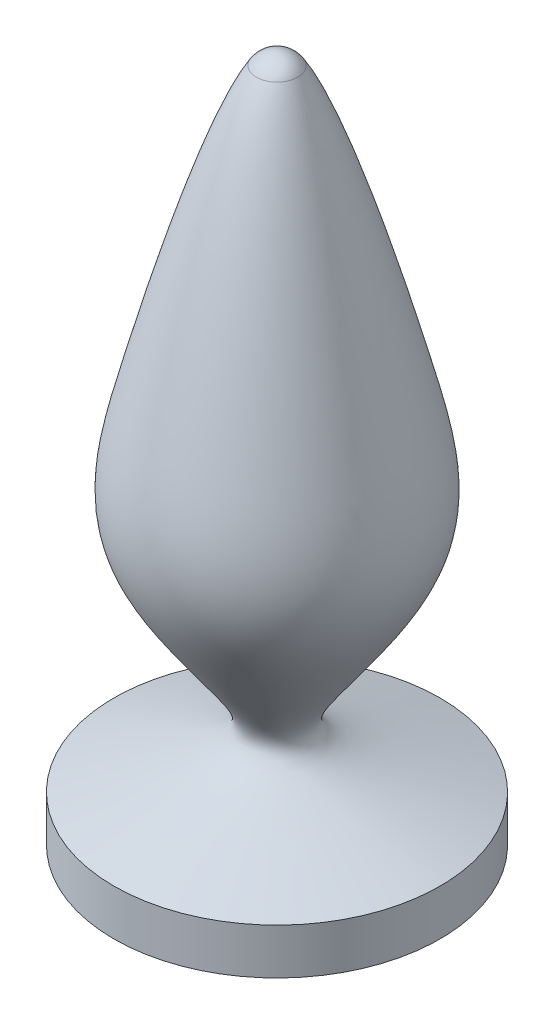
ISO-10303-21;
HEADER;
FILE_DESCRIPTION(('STEP AP214'),'2;1');
FILE_NAME('part.step','',(''),(''),'','','');
FILE_SCHEMA(('AUTOMOTIVE_DESIGN { 1 0 10303 214 1 1 1 1 }'));
ENDSEC;
DATA;
#1=APPLICATION_CONTEXT('core data for automotive mechanical design processes');
#2=APPLICATION_PROTOCOL_DEFINITION('international standard','automotive_design',2000,#1);
#3=PRODUCT_CONTEXT('',#1,'mechanical');
#4=PRODUCT('Part','Part','',(#3));
#5=PRODUCT_RELATED_PRODUCT_CATEGORY('part','',(#4));
#6=PRODUCT_DEFINITION_FORMATION('','',#4);
#7=PRODUCT_DEFINITION_CONTEXT('part definition',#1,'design');
#8=PRODUCT_DEFINITION('design','',#6,#7);
#9=PRODUCT_DEFINITION_SHAPE('','',#8);
#10=(LENGTH_UNIT() NAMED_UNIT(*) SI_UNIT(.MILLI.,.METRE.));
#11=(NAMED_UNIT(*) PLANE_ANGLE_UNIT() SI_UNIT($,.RADIAN.));
#12=(NAMED_UNIT(*) SI_UNIT($,.STERADIAN.) SOLID_ANGLE_UNIT());
#13=UNCERTAINTY_MEASURE_WITH_UNIT(LENGTH_MEASURE(1.E-05),#10,'distance_accuracy_value','');
#14=(GEOMETRIC_REPRESENTATION_CONTEXT(3) GLOBAL_UNCERTAINTY_ASSIGNED_CONTEXT((#13)) GLOBAL_UNIT_ASSIGNED_CONTEXT((#10,
#11,#12)) REPRESENTATION_CONTEXT('',''));
#15=CARTESIAN_POINT('',(0.,0.,0.));
#16=DIRECTION('',(0.,0.,1.));
#17=DIRECTION('',(1.,0.,0.));
#18=AXIS2_PLACEMENT_3D('',#15,#16,#17);
#19=CARTESIAN_POINT('',(16.9545,-71.3771720125921,0.));
#20=DIRECTION('',(0.,-1.,0.));
#21=DIRECTION('',(0.,0.,-1.));
#22=AXIS2_PLACEMENT_3D('',#19,#20,#21);
#23=PLANE('',#22);
#24=CARTESIAN_POINT('',(0.,-71.3771720125921,0.));
#25=DIRECTION('',(0.,-1.,0.));
#26=DIRECTION('',(0.,0.,-1.));
#27=AXIS2_PLACEMENT_3D('',#24,#25,#26);
#28=CIRCLE('',#27,16.9545);
#29=CARTESIAN_POINT('',(0.,-71.3771720125921,-16.9545));
#30=VERTEX_POINT('',#29);
#31=EDGE_CURVE('E10',#30,#30,#28,.T.);
#32=ORIENTED_EDGE('',*,*,#31,.T.);
#33=EDGE_LOOP('',(#32));
#34=FACE_BOUND('',#33,.T.);
#35=ADVANCED_FACE('F38',(#34),#23,.T.);
#36=CARTESIAN_POINT('',(0.,-71.3771720125921,0.));
#37=DIRECTION('',(0.,-1.,0.));
#38=DIRECTION('',(0.,0.,-1.));
#39=AXIS2_PLACEMENT_3D('',#36,#37,#38);
#40=CYLINDRICAL_SURFACE('',#39,16.9544999999998);
#41=CARTESIAN_POINT('',(0.,-66.614672012592,0.));
#42=DIRECTION('',(0.,-1.,0.));
#43=DIRECTION('',(0.,0.,-1.));
#44=AXIS2_PLACEMENT_3D('',#41,#42,#43);
#45=CIRCLE('',#44,16.9544999999997);
#46=CARTESIAN_POINT('',(0.,-66.614672012592,-16.9544999999997));
#47=VERTEX_POINT('',#46);
#48=EDGE_CURVE('E44',#47,#47,#45,.T.);
#49=ORIENTED_EDGE('',*,*,#48,.T.);
#50=EDGE_LOOP('',(#49));
#51=FACE_BOUND('',#50,.T.);
#52=ORIENTED_EDGE('',*,*,#31,.F.);
#53=EDGE_LOOP('',(#52));
#54=FACE_BOUND('',#53,.T.);
#55=ADVANCED_FACE('F65',(#51,#54),#40,.T.);
#56=CARTESIAN_POINT('',(16.9544999999997,-66.614672012592,0.));
#57=CARTESIAN_POINT('',(0.808405214050559,-60.9479264676867,0.));
#58=CARTESIAN_POINT('',(1.14259265918861,-61.924501885455,0.));
#59=CARTESIAN_POINT('',(12.2739428007959,-46.216037014803,0.));
#60=CARTESIAN_POINT('',(14.5260203390547,-40.9815264299858,0.));
#61=CARTESIAN_POINT('',(8.98043062425941,-18.8821179330674,0.));
#62=CARTESIAN_POINT('',(4.70283696743008,-5.21078677583494,0.));
#63=CARTESIAN_POINT('',(2.14469056079191,-1.1791537932411,0.));
#64=B_SPLINE_CURVE_WITH_KNOTS('',3,(#56,#57,#58,#59,#60,#61,#62,#63),.UNSPECIFIED.,.F.,.F.,(4,1,
1,1,1,4),(0.105965392109123,0.387599050081787,0.420534076841615,0.597790145714446,
0.657952438891195,1.),.UNSPECIFIED.);
#65=CARTESIAN_POINT('',(0.,-71.3771720125921,0.));
#66=DIRECTION('',(0.,-1.,0.));
#67=AXIS1_PLACEMENT('',#65,#66);
#68=SURFACE_OF_REVOLUTION('',#64,#67);
#69=CARTESIAN_POINT('',(0.,-1.1791537932411,0.));
#70=DIRECTION('',(0.,-1.,0.));
#71=DIRECTION('',(0.,0.,-1.));
#72=AXIS2_PLACEMENT_3D('',#69,#70,#71);
#73=CIRCLE('',#72,2.14469056079191);
#74=CARTESIAN_POINT('',(0.,-1.1791537932411,-2.14469056079191));
#75=VERTEX_POINT('',#74);
#76=EDGE_CURVE('E48',#75,#75,#73,.T.);
#77=ORIENTED_EDGE('',*,*,#76,.T.);
#78=EDGE_LOOP('',(#77));
#79=FACE_BOUND('',#78,.T.);
#80=ORIENTED_EDGE('',*,*,#48,.F.);
#81=EDGE_LOOP('',(#80));
#82=FACE_BOUND('',#81,.T.);
#83=ADVANCED_FACE('F61',(#79,#82),#68,.F.);
#84=CARTESIAN_POINT('',(0.,-2.54,0.));
#85=DIRECTION('',(0.,-1.,0.));
#86=DIRECTION('',(1.,0.,0.));
#87=AXIS2_PLACEMENT_3D('',#84,#85,#86);
#88=SPHERICAL_SURFACE('',#87,2.54);
#89=ORIENTED_EDGE('',*,*,#76,.F.);
#90=EDGE_LOOP('',(#89));
#91=FACE_BOUND('',#90,.T.);
#92=ADVANCED_FACE('F64',(#91),#88,.T.);
#93=CLOSED_SHELL('',(#35,#55,#83,#92));
#94=MANIFOLD_SOLID_BREP('B2',#93);
#95=ADVANCED_BREP_SHAPE_REPRESENTATION('',(#18,#94),#14);
#96=SHAPE_DEFINITION_REPRESENTATION(#9,#95);
ENDSEC;
END-ISO-10303-21;
